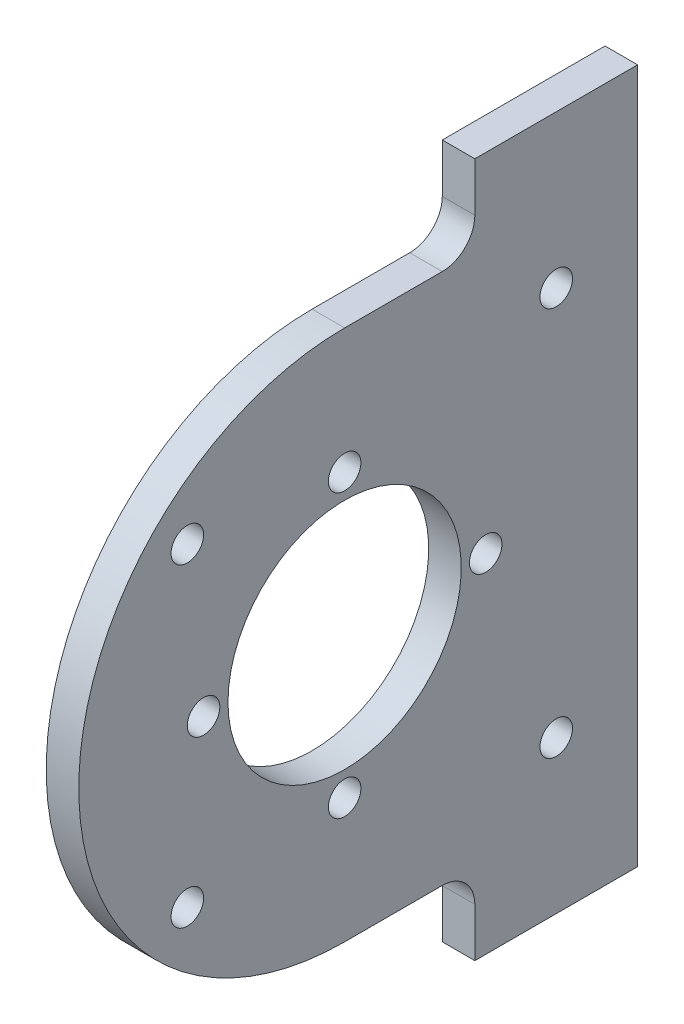
ISO-10303-21;
HEADER;
FILE_DESCRIPTION(('STEP AP214'),'2;1');
FILE_NAME('part.step','',(''),(''),'','','');
FILE_SCHEMA(('AUTOMOTIVE_DESIGN { 1 0 10303 214 1 1 1 1 }'));
ENDSEC;
DATA;
#1=APPLICATION_CONTEXT('core data for automotive mechanical design processes');
#2=APPLICATION_PROTOCOL_DEFINITION('international standard','automotive_design',2000,#1);
#3=PRODUCT_CONTEXT('',#1,'mechanical');
#4=PRODUCT('Part','Part','',(#3));
#5=PRODUCT_RELATED_PRODUCT_CATEGORY('part','',(#4));
#6=PRODUCT_DEFINITION_FORMATION('','',#4);
#7=PRODUCT_DEFINITION_CONTEXT('part definition',#1,'design');
#8=PRODUCT_DEFINITION('design','',#6,#7);
#9=PRODUCT_DEFINITION_SHAPE('','',#8);
#10=(LENGTH_UNIT() NAMED_UNIT(*) SI_UNIT(.MILLI.,.METRE.));
#11=(NAMED_UNIT(*) PLANE_ANGLE_UNIT() SI_UNIT($,.RADIAN.));
#12=(NAMED_UNIT(*) SI_UNIT($,.STERADIAN.) SOLID_ANGLE_UNIT());
#13=UNCERTAINTY_MEASURE_WITH_UNIT(LENGTH_MEASURE(1.E-05),#10,'distance_accuracy_value','');
#14=(GEOMETRIC_REPRESENTATION_CONTEXT(3) GLOBAL_UNCERTAINTY_ASSIGNED_CONTEXT((#13)) GLOBAL_UNIT_ASSIGNED_CONTEXT((#10,
#11,#12)) REPRESENTATION_CONTEXT('',''));
#15=CARTESIAN_POINT('',(0.,0.,0.));
#16=DIRECTION('',(0.,0.,1.));
#17=DIRECTION('',(1.,0.,0.));
#18=AXIS2_PLACEMENT_3D('',#15,#16,#17);
#19=CARTESIAN_POINT('',(-109.5,-24.5,0.));
#20=DIRECTION('',(0.,-1.,0.));
#21=DIRECTION('',(0.,0.,-1.));
#22=AXIS2_PLACEMENT_3D('',#19,#20,#21);
#23=PLANE('',#22);
#24=DIRECTION('',(0.,0.,1.));
#25=VECTOR('',#24,1.);
#26=CARTESIAN_POINT('',(-112.5,-24.5,0.));
#27=LINE('',#26,#25);
#28=CARTESIAN_POINT('',(-112.5,-24.5,21.));
#29=VERTEX_POINT('',#28);
#30=CARTESIAN_POINT('',(-112.5,-24.5,30.));
#31=VERTEX_POINT('',#30);
#32=EDGE_CURVE('E185',#29,#31,#27,.T.);
#33=ORIENTED_EDGE('',*,*,#32,.F.);
#34=DIRECTION('',(-1.,0.,0.));
#35=VECTOR('',#34,1.);
#36=CARTESIAN_POINT('',(-109.5,-24.5,21.));
#37=LINE('',#36,#35);
#38=CARTESIAN_POINT('',(-109.5,-24.5,21.));
#39=VERTEX_POINT('',#38);
#40=EDGE_CURVE('E13',#39,#29,#37,.T.);
#41=ORIENTED_EDGE('',*,*,#40,.F.);
#42=DIRECTION('',(0.,0.,1.));
#43=VECTOR('',#42,1.);
#44=CARTESIAN_POINT('',(-109.5,-24.5,0.));
#45=LINE('',#44,#43);
#46=CARTESIAN_POINT('',(-109.5,-24.5,30.));
#47=VERTEX_POINT('',#46);
#48=EDGE_CURVE('E228',#39,#47,#45,.T.);
#49=ORIENTED_EDGE('',*,*,#48,.T.);
#50=DIRECTION('',(-1.,0.,0.));
#51=VECTOR('',#50,1.);
#52=CARTESIAN_POINT('',(-109.5,-24.5,30.));
#53=LINE('',#52,#51);
#54=EDGE_CURVE('E52',#47,#31,#53,.T.);
#55=ORIENTED_EDGE('',*,*,#54,.T.);
#56=EDGE_LOOP('',(#33,#41,#49,#55));
#57=FACE_BOUND('',#56,.T.);
#58=ADVANCED_FACE('F48',(#57),#23,.T.);
#59=CARTESIAN_POINT('',(-109.5,-27.5,21.));
#60=DIRECTION('',(-1.,0.,0.));
#61=DIRECTION('',(0.,0.,1.));
#62=AXIS2_PLACEMENT_3D('',#59,#60,#61);
#63=CYLINDRICAL_SURFACE('',#62,3.);
#64=CARTESIAN_POINT('',(-112.5,-27.5,21.));
#65=DIRECTION('',(-1.,0.,0.));
#66=DIRECTION('',(0.,0.,1.));
#67=AXIS2_PLACEMENT_3D('',#64,#65,#66);
#68=CIRCLE('',#67,3.);
#69=CARTESIAN_POINT('',(-112.5,-27.5,18.));
#70=VERTEX_POINT('',#69);
#71=EDGE_CURVE('E209',#70,#29,#68,.F.);
#72=ORIENTED_EDGE('',*,*,#71,.F.);
#73=DIRECTION('',(-1.,0.,0.));
#74=VECTOR('',#73,1.);
#75=CARTESIAN_POINT('',(-109.5,-27.5,18.));
#76=LINE('',#75,#74);
#77=CARTESIAN_POINT('',(-109.5,-27.5,18.));
#78=VERTEX_POINT('',#77);
#79=EDGE_CURVE('E58',#78,#70,#76,.T.);
#80=ORIENTED_EDGE('',*,*,#79,.F.);
#81=CARTESIAN_POINT('',(-109.5,-27.5,21.));
#82=DIRECTION('',(-1.,0.,0.));
#83=DIRECTION('',(0.,0.,1.));
#84=AXIS2_PLACEMENT_3D('',#81,#82,#83);
#85=CIRCLE('',#84,3.);
#86=EDGE_CURVE('E147',#78,#39,#85,.F.);
#87=ORIENTED_EDGE('',*,*,#86,.T.);
#88=ORIENTED_EDGE('',*,*,#40,.T.);
#89=EDGE_LOOP('',(#72,#80,#87,#88));
#90=FACE_BOUND('',#89,.T.);
#91=ADVANCED_FACE('F232',(#90),#63,.F.);
#92=CARTESIAN_POINT('',(-109.5,0.,18.));
#93=DIRECTION('',(0.,0.,1.));
#94=DIRECTION('',(1.,0.,0.));
#95=AXIS2_PLACEMENT_3D('',#92,#93,#94);
#96=PLANE('',#95);
#97=DIRECTION('',(0.,1.,0.));
#98=VECTOR('',#97,1.);
#99=CARTESIAN_POINT('',(-112.5,0.,18.));
#100=LINE('',#99,#98);
#101=CARTESIAN_POINT('',(-112.5,-32.,18.));
#102=VERTEX_POINT('',#101);
#103=EDGE_CURVE('E135',#102,#70,#100,.T.);
#104=ORIENTED_EDGE('',*,*,#103,.F.);
#105=DIRECTION('',(-1.,0.,0.));
#106=VECTOR('',#105,1.);
#107=CARTESIAN_POINT('',(-109.5,-32.,18.));
#108=LINE('',#107,#106);
#109=CARTESIAN_POINT('',(-109.5,-32.,18.));
#110=VERTEX_POINT('',#109);
#111=EDGE_CURVE('E130',#110,#102,#108,.T.);
#112=ORIENTED_EDGE('',*,*,#111,.F.);
#113=DIRECTION('',(0.,1.,0.));
#114=VECTOR('',#113,1.);
#115=CARTESIAN_POINT('',(-109.5,0.,18.));
#116=LINE('',#115,#114);
#117=EDGE_CURVE('E133',#110,#78,#116,.T.);
#118=ORIENTED_EDGE('',*,*,#117,.T.);
#119=ORIENTED_EDGE('',*,*,#79,.T.);
#120=EDGE_LOOP('',(#104,#112,#118,#119));
#121=FACE_BOUND('',#120,.T.);
#122=ADVANCED_FACE('F132',(#121),#96,.T.);
#123=CARTESIAN_POINT('',(-109.5,-32.,0.));
#124=DIRECTION('',(0.,-1.,0.));
#125=DIRECTION('',(0.,0.,-1.));
#126=AXIS2_PLACEMENT_3D('',#123,#124,#125);
#127=PLANE('',#126);
#128=DIRECTION('',(0.,0.,1.));
#129=VECTOR('',#128,1.);
#130=CARTESIAN_POINT('',(-112.5,-32.,0.));
#131=LINE('',#130,#129);
#132=CARTESIAN_POINT('',(-112.5,-32.,3.));
#133=VERTEX_POINT('',#132);
#134=EDGE_CURVE('E206',#133,#102,#131,.T.);
#135=ORIENTED_EDGE('',*,*,#134,.F.);
#136=DIRECTION('',(-1.,0.,0.));
#137=VECTOR('',#136,1.);
#138=CARTESIAN_POINT('',(-109.5,-32.,3.));
#139=LINE('',#138,#137);
#140=CARTESIAN_POINT('',(-109.5,-32.,3.));
#141=VERTEX_POINT('',#140);
#142=EDGE_CURVE('E140',#141,#133,#139,.T.);
#143=ORIENTED_EDGE('',*,*,#142,.F.);
#144=DIRECTION('',(0.,0.,1.));
#145=VECTOR('',#144,1.);
#146=CARTESIAN_POINT('',(-109.5,-32.,0.));
#147=LINE('',#146,#145);
#148=EDGE_CURVE('E146',#141,#110,#147,.T.);
#149=ORIENTED_EDGE('',*,*,#148,.T.);
#150=ORIENTED_EDGE('',*,*,#111,.T.);
#151=EDGE_LOOP('',(#135,#143,#149,#150));
#152=FACE_BOUND('',#151,.T.);
#153=ADVANCED_FACE('F149',(#152),#127,.T.);
#154=CARTESIAN_POINT('',(-109.5,0.,3.));
#155=DIRECTION('',(0.,0.,1.));
#156=DIRECTION('',(1.,0.,0.));
#157=AXIS2_PLACEMENT_3D('',#154,#155,#156);
#158=PLANE('',#157);
#159=DIRECTION('',(0.,1.,0.));
#160=VECTOR('',#159,1.);
#161=CARTESIAN_POINT('',(-112.5,0.,3.));
#162=LINE('',#161,#160);
#163=CARTESIAN_POINT('',(-112.5,32.,3.));
#164=VERTEX_POINT('',#163);
#165=EDGE_CURVE('E203',#133,#164,#162,.T.);
#166=ORIENTED_EDGE('',*,*,#165,.T.);
#167=DIRECTION('',(-1.,0.,0.));
#168=VECTOR('',#167,1.);
#169=CARTESIAN_POINT('',(-109.5,32.,3.));
#170=LINE('',#169,#168);
#171=CARTESIAN_POINT('',(-109.5,32.,3.));
#172=VERTEX_POINT('',#171);
#173=EDGE_CURVE('E215',#172,#164,#170,.T.);
#174=ORIENTED_EDGE('',*,*,#173,.F.);
#175=DIRECTION('',(0.,1.,0.));
#176=VECTOR('',#175,1.);
#177=CARTESIAN_POINT('',(-109.5,0.,3.));
#178=LINE('',#177,#176);
#179=EDGE_CURVE('E151',#141,#172,#178,.T.);
#180=ORIENTED_EDGE('',*,*,#179,.F.);
#181=ORIENTED_EDGE('',*,*,#142,.T.);
#182=EDGE_LOOP('',(#166,#174,#180,#181));
#183=FACE_BOUND('',#182,.T.);
#184=ADVANCED_FACE('F246',(#183),#158,.F.);
#185=CARTESIAN_POINT('',(-109.5,32.,0.));
#186=DIRECTION('',(0.,-1.,0.));
#187=DIRECTION('',(0.,0.,-1.));
#188=AXIS2_PLACEMENT_3D('',#185,#186,#187);
#189=PLANE('',#188);
#190=DIRECTION('',(0.,0.,1.));
#191=VECTOR('',#190,1.);
#192=CARTESIAN_POINT('',(-112.5,32.,0.));
#193=LINE('',#192,#191);
#194=CARTESIAN_POINT('',(-112.5,32.,18.));
#195=VERTEX_POINT('',#194);
#196=EDGE_CURVE('E200',#164,#195,#193,.T.);
#197=ORIENTED_EDGE('',*,*,#196,.T.);
#198=DIRECTION('',(-1.,0.,0.));
#199=VECTOR('',#198,1.);
#200=CARTESIAN_POINT('',(-109.5,32.,18.));
#201=LINE('',#200,#199);
#202=CARTESIAN_POINT('',(-109.5,32.,18.));
#203=VERTEX_POINT('',#202);
#204=EDGE_CURVE('E218',#203,#195,#201,.T.);
#205=ORIENTED_EDGE('',*,*,#204,.F.);
#206=DIRECTION('',(0.,0.,1.));
#207=VECTOR('',#206,1.);
#208=CARTESIAN_POINT('',(-109.5,32.,0.));
#209=LINE('',#208,#207);
#210=EDGE_CURVE('E153',#172,#203,#209,.T.);
#211=ORIENTED_EDGE('',*,*,#210,.F.);
#212=ORIENTED_EDGE('',*,*,#173,.T.);
#213=EDGE_LOOP('',(#197,#205,#211,#212));
#214=FACE_BOUND('',#213,.T.);
#215=ADVANCED_FACE('F249',(#214),#189,.F.);
#216=CARTESIAN_POINT('',(-109.5,0.,18.));
#217=DIRECTION('',(0.,0.,-1.));
#218=DIRECTION('',(-1.,0.,0.));
#219=AXIS2_PLACEMENT_3D('',#216,#217,#218);
#220=PLANE('',#219);
#221=DIRECTION('',(0.,-1.,0.));
#222=VECTOR('',#221,1.);
#223=CARTESIAN_POINT('',(-112.5,0.,18.));
#224=LINE('',#223,#222);
#225=CARTESIAN_POINT('',(-112.5,27.5,18.));
#226=VERTEX_POINT('',#225);
#227=EDGE_CURVE('E197',#195,#226,#224,.T.);
#228=ORIENTED_EDGE('',*,*,#227,.T.);
#229=DIRECTION('',(-1.,0.,0.));
#230=VECTOR('',#229,1.);
#231=CARTESIAN_POINT('',(-109.5,27.5,18.));
#232=LINE('',#231,#230);
#233=CARTESIAN_POINT('',(-109.5,27.5,18.));
#234=VERTEX_POINT('',#233);
#235=EDGE_CURVE('E221',#234,#226,#232,.T.);
#236=ORIENTED_EDGE('',*,*,#235,.F.);
#237=DIRECTION('',(0.,-1.,0.));
#238=VECTOR('',#237,1.);
#239=CARTESIAN_POINT('',(-109.5,0.,18.));
#240=LINE('',#239,#238);
#241=EDGE_CURVE('E382',#203,#234,#240,.T.);
#242=ORIENTED_EDGE('',*,*,#241,.F.);
#243=ORIENTED_EDGE('',*,*,#204,.T.);
#244=EDGE_LOOP('',(#228,#236,#242,#243));
#245=FACE_BOUND('',#244,.T.);
#246=ADVANCED_FACE('F253',(#245),#220,.F.);
#247=CARTESIAN_POINT('',(-109.5,27.5,21.));
#248=DIRECTION('',(-1.,0.,0.));
#249=DIRECTION('',(0.,0.,1.));
#250=AXIS2_PLACEMENT_3D('',#247,#248,#249);
#251=CYLINDRICAL_SURFACE('',#250,3.);
#252=CARTESIAN_POINT('',(-112.5,27.5,21.));
#253=DIRECTION('',(-1.,0.,0.));
#254=DIRECTION('',(0.,0.,1.));
#255=AXIS2_PLACEMENT_3D('',#252,#253,#254);
#256=CIRCLE('',#255,3.);
#257=CARTESIAN_POINT('',(-112.5,24.5,21.));
#258=VERTEX_POINT('',#257);
#259=EDGE_CURVE('E194',#226,#258,#256,.T.);
#260=ORIENTED_EDGE('',*,*,#259,.T.);
#261=DIRECTION('',(-1.,0.,0.));
#262=VECTOR('',#261,1.);
#263=CARTESIAN_POINT('',(-109.5,24.5,21.));
#264=LINE('',#263,#262);
#265=CARTESIAN_POINT('',(-109.5,24.5,21.));
#266=VERTEX_POINT('',#265);
#267=EDGE_CURVE('E224',#266,#258,#264,.T.);
#268=ORIENTED_EDGE('',*,*,#267,.F.);
#269=CARTESIAN_POINT('',(-109.5,27.5,21.));
#270=DIRECTION('',(-1.,0.,0.));
#271=DIRECTION('',(0.,0.,1.));
#272=AXIS2_PLACEMENT_3D('',#269,#270,#271);
#273=CIRCLE('',#272,3.);
#274=EDGE_CURVE('E379',#234,#266,#273,.T.);
#275=ORIENTED_EDGE('',*,*,#274,.F.);
#276=ORIENTED_EDGE('',*,*,#235,.T.);
#277=EDGE_LOOP('',(#260,#268,#275,#276));
#278=FACE_BOUND('',#277,.T.);
#279=ADVANCED_FACE('F257',(#278),#251,.F.);
#280=CARTESIAN_POINT('',(-109.5,24.5,0.));
#281=DIRECTION('',(0.,-1.,0.));
#282=DIRECTION('',(0.,0.,-1.));
#283=AXIS2_PLACEMENT_3D('',#280,#281,#282);
#284=PLANE('',#283);
#285=DIRECTION('',(0.,0.,1.));
#286=VECTOR('',#285,1.);
#287=CARTESIAN_POINT('',(-112.5,24.5,0.));
#288=LINE('',#287,#286);
#289=CARTESIAN_POINT('',(-112.5,24.5,30.));
#290=VERTEX_POINT('',#289);
#291=EDGE_CURVE('E191',#258,#290,#288,.T.);
#292=ORIENTED_EDGE('',*,*,#291,.T.);
#293=DIRECTION('',(-1.,0.,0.));
#294=VECTOR('',#293,1.);
#295=CARTESIAN_POINT('',(-109.5,24.5,30.));
#296=LINE('',#295,#294);
#297=CARTESIAN_POINT('',(-109.5,24.5,30.));
#298=VERTEX_POINT('',#297);
#299=EDGE_CURVE('E226',#298,#290,#296,.T.);
#300=ORIENTED_EDGE('',*,*,#299,.F.);
#301=DIRECTION('',(0.,0.,1.));
#302=VECTOR('',#301,1.);
#303=CARTESIAN_POINT('',(-109.5,24.5,0.));
#304=LINE('',#303,#302);
#305=EDGE_CURVE('E377',#266,#298,#304,.T.);
#306=ORIENTED_EDGE('',*,*,#305,.F.);
#307=ORIENTED_EDGE('',*,*,#267,.T.);
#308=EDGE_LOOP('',(#292,#300,#306,#307));
#309=FACE_BOUND('',#308,.T.);
#310=ADVANCED_FACE('F261',(#309),#284,.F.);
#311=CARTESIAN_POINT('',(-109.5,-17.9443584449264,10.5));
#312=DIRECTION('',(-1.,0.,0.));
#313=DIRECTION('',(0.,0.,1.));
#314=AXIS2_PLACEMENT_3D('',#311,#312,#313);
#315=CYLINDRICAL_SURFACE('',#314,1.5);
#316=CARTESIAN_POINT('',(-109.5,-17.9443584449264,10.5));
#317=DIRECTION('',(-1.,0.,0.));
#318=DIRECTION('',(0.,0.,1.));
#319=AXIS2_PLACEMENT_3D('',#316,#317,#318);
#320=CIRCLE('',#319,1.5);
#321=CARTESIAN_POINT('',(-109.5,-17.9443584449264,12.));
#322=VERTEX_POINT('',#321);
#323=EDGE_CURVE('E369',#322,#322,#320,.T.);
#324=ORIENTED_EDGE('',*,*,#323,.F.);
#325=EDGE_LOOP('',(#324));
#326=FACE_BOUND('',#325,.T.);
#327=CARTESIAN_POINT('',(-112.5,-17.9443584449264,10.5));
#328=DIRECTION('',(-1.,0.,0.));
#329=DIRECTION('',(0.,0.,1.));
#330=AXIS2_PLACEMENT_3D('',#327,#328,#329);
#331=CIRCLE('',#330,1.5);
#332=CARTESIAN_POINT('',(-112.5,-17.9443584449264,12.));
#333=VERTEX_POINT('',#332);
#334=EDGE_CURVE('E182',#333,#333,#331,.T.);
#335=ORIENTED_EDGE('',*,*,#334,.T.);
#336=EDGE_LOOP('',(#335));
#337=FACE_BOUND('',#336,.T.);
#338=ADVANCED_FACE('F265',(#326,#337),#315,.F.);
#339=CARTESIAN_POINT('',(-109.5,13.,30.));
#340=DIRECTION('',(-1.,0.,0.));
#341=DIRECTION('',(0.,0.,1.));
#342=AXIS2_PLACEMENT_3D('',#339,#340,#341);
#343=CYLINDRICAL_SURFACE('',#342,1.5);
#344=CARTESIAN_POINT('',(-109.5,13.,30.));
#345=DIRECTION('',(-1.,0.,0.));
#346=DIRECTION('',(0.,0.,1.));
#347=AXIS2_PLACEMENT_3D('',#344,#345,#346);
#348=CIRCLE('',#347,1.5);
#349=CARTESIAN_POINT('',(-109.5,13.,31.5));
#350=VERTEX_POINT('',#349);
#351=EDGE_CURVE('E366',#350,#350,#348,.T.);
#352=ORIENTED_EDGE('',*,*,#351,.F.);
#353=EDGE_LOOP('',(#352));
#354=FACE_BOUND('',#353,.T.);
#355=CARTESIAN_POINT('',(-112.5,13.,30.));
#356=DIRECTION('',(-1.,0.,0.));
#357=DIRECTION('',(0.,0.,1.));
#358=AXIS2_PLACEMENT_3D('',#355,#356,#357);
#359=CIRCLE('',#358,1.5);
#360=CARTESIAN_POINT('',(-112.5,13.,31.5));
#361=VERTEX_POINT('',#360);
#362=EDGE_CURVE('E179',#361,#361,#359,.T.);
#363=ORIENTED_EDGE('',*,*,#362,.T.);
#364=EDGE_LOOP('',(#363));
#365=FACE_BOUND('',#364,.T.);
#366=ADVANCED_FACE('F271',(#354,#365),#343,.F.);
#367=CARTESIAN_POINT('',(-109.5,0.,43.));
#368=DIRECTION('',(-1.,0.,0.));
#369=DIRECTION('',(0.,0.,1.));
#370=AXIS2_PLACEMENT_3D('',#367,#368,#369);
#371=CYLINDRICAL_SURFACE('',#370,1.5);
#372=CARTESIAN_POINT('',(-109.5,0.,43.));
#373=DIRECTION('',(-1.,0.,0.));
#374=DIRECTION('',(0.,0.,1.));
#375=AXIS2_PLACEMENT_3D('',#372,#373,#374);
#376=CIRCLE('',#375,1.5);
#377=CARTESIAN_POINT('',(-109.5,0.,44.5));
#378=VERTEX_POINT('',#377);
#379=EDGE_CURVE('E362',#378,#378,#376,.T.);
#380=ORIENTED_EDGE('',*,*,#379,.F.);
#381=EDGE_LOOP('',(#380));
#382=FACE_BOUND('',#381,.T.);
#383=CARTESIAN_POINT('',(-112.5,0.,43.));
#384=DIRECTION('',(-1.,0.,0.));
#385=DIRECTION('',(0.,0.,1.));
#386=AXIS2_PLACEMENT_3D('',#383,#384,#385);
#387=CIRCLE('',#386,1.5);
#388=CARTESIAN_POINT('',(-112.5,0.,44.5));
#389=VERTEX_POINT('',#388);
#390=EDGE_CURVE('E176',#389,#389,#387,.T.);
#391=ORIENTED_EDGE('',*,*,#390,.T.);
#392=EDGE_LOOP('',(#391));
#393=FACE_BOUND('',#392,.T.);
#394=ADVANCED_FACE('F275',(#382,#393),#371,.F.);
#395=CARTESIAN_POINT('',(-109.5,-13.,30.));
#396=DIRECTION('',(-1.,0.,0.));
#397=DIRECTION('',(0.,0.,1.));
#398=AXIS2_PLACEMENT_3D('',#395,#396,#397);
#399=CYLINDRICAL_SURFACE('',#398,1.5);
#400=CARTESIAN_POINT('',(-109.5,-13.,30.));
#401=DIRECTION('',(-1.,0.,0.));
#402=DIRECTION('',(0.,0.,1.));
#403=AXIS2_PLACEMENT_3D('',#400,#401,#402);
#404=CIRCLE('',#403,1.5);
#405=CARTESIAN_POINT('',(-109.5,-13.,31.5));
#406=VERTEX_POINT('',#405);
#407=EDGE_CURVE('E358',#406,#406,#404,.T.);
#408=ORIENTED_EDGE('',*,*,#407,.F.);
#409=EDGE_LOOP('',(#408));
#410=FACE_BOUND('',#409,.T.);
#411=CARTESIAN_POINT('',(-112.5,-13.,30.));
#412=DIRECTION('',(-1.,0.,0.));
#413=DIRECTION('',(0.,0.,1.));
#414=AXIS2_PLACEMENT_3D('',#411,#412,#413);
#415=CIRCLE('',#414,1.5);
#416=CARTESIAN_POINT('',(-112.5,-13.,31.5));
#417=VERTEX_POINT('',#416);
#418=EDGE_CURVE('E173',#417,#417,#415,.T.);
#419=ORIENTED_EDGE('',*,*,#418,.T.);
#420=EDGE_LOOP('',(#419));
#421=FACE_BOUND('',#420,.T.);
#422=ADVANCED_FACE('F279',(#410,#421),#399,.F.);
#423=CARTESIAN_POINT('',(-109.5,0.,17.));
#424=DIRECTION('',(-1.,0.,0.));
#425=DIRECTION('',(0.,0.,1.));
#426=AXIS2_PLACEMENT_3D('',#423,#424,#425);
#427=CYLINDRICAL_SURFACE('',#426,1.5);
#428=CARTESIAN_POINT('',(-109.5,0.,17.));
#429=DIRECTION('',(-1.,0.,0.));
#430=DIRECTION('',(0.,0.,1.));
#431=AXIS2_PLACEMENT_3D('',#428,#429,#430);
#432=CIRCLE('',#431,1.5);
#433=CARTESIAN_POINT('',(-109.5,0.,18.5));
#434=VERTEX_POINT('',#433);
#435=EDGE_CURVE('E354',#434,#434,#432,.T.);
#436=ORIENTED_EDGE('',*,*,#435,.F.);
#437=EDGE_LOOP('',(#436));
#438=FACE_BOUND('',#437,.T.);
#439=CARTESIAN_POINT('',(-112.5,0.,17.));
#440=DIRECTION('',(-1.,0.,0.));
#441=DIRECTION('',(0.,0.,1.));
#442=AXIS2_PLACEMENT_3D('',#439,#440,#441);
#443=CIRCLE('',#442,1.5);
#444=CARTESIAN_POINT('',(-112.5,0.,18.5));
#445=VERTEX_POINT('',#444);
#446=EDGE_CURVE('E170',#445,#445,#443,.T.);
#447=ORIENTED_EDGE('',*,*,#446,.T.);
#448=EDGE_LOOP('',(#447));
#449=FACE_BOUND('',#448,.T.);
#450=ADVANCED_FACE('F283',(#438,#449),#427,.F.);
#451=CARTESIAN_POINT('',(-109.5,0.,30.));
#452=DIRECTION('',(-1.,0.,0.));
#453=DIRECTION('',(0.,0.,1.));
#454=AXIS2_PLACEMENT_3D('',#451,#452,#453);
#455=CYLINDRICAL_SURFACE('',#454,10.75);
#456=CARTESIAN_POINT('',(-109.5,0.,30.));
#457=DIRECTION('',(-1.,0.,0.));
#458=DIRECTION('',(0.,0.,1.));
#459=AXIS2_PLACEMENT_3D('',#456,#457,#458);
#460=CIRCLE('',#459,10.75);
#461=CARTESIAN_POINT('',(-109.5,0.,40.75));
#462=VERTEX_POINT('',#461);
#463=EDGE_CURVE('E350',#462,#462,#460,.T.);
#464=ORIENTED_EDGE('',*,*,#463,.F.);
#465=EDGE_LOOP('',(#464));
#466=FACE_BOUND('',#465,.T.);
#467=CARTESIAN_POINT('',(-112.5,0.,30.));
#468=DIRECTION('',(-1.,0.,0.));
#469=DIRECTION('',(0.,0.,1.));
#470=AXIS2_PLACEMENT_3D('',#467,#468,#469);
#471=CIRCLE('',#470,10.75);
#472=CARTESIAN_POINT('',(-112.5,0.,40.75));
#473=VERTEX_POINT('',#472);
#474=EDGE_CURVE('E167',#473,#473,#471,.T.);
#475=ORIENTED_EDGE('',*,*,#474,.T.);
#476=EDGE_LOOP('',(#475));
#477=FACE_BOUND('',#476,.T.);
#478=ADVANCED_FACE('F287',(#466,#477),#455,.F.);
#479=CARTESIAN_POINT('',(-109.5,17.9443584449264,10.5));
#480=DIRECTION('',(-1.,0.,0.));
#481=DIRECTION('',(0.,0.,1.));
#482=AXIS2_PLACEMENT_3D('',#479,#480,#481);
#483=CYLINDRICAL_SURFACE('',#482,1.5);
#484=CARTESIAN_POINT('',(-109.5,17.9443584449264,10.5));
#485=DIRECTION('',(-1.,0.,0.));
#486=DIRECTION('',(0.,0.,1.));
#487=AXIS2_PLACEMENT_3D('',#484,#485,#486);
#488=CIRCLE('',#487,1.5);
#489=CARTESIAN_POINT('',(-109.5,17.9443584449264,12.));
#490=VERTEX_POINT('',#489);
#491=EDGE_CURVE('E346',#490,#490,#488,.F.);
#492=ORIENTED_EDGE('',*,*,#491,.T.);
#493=EDGE_LOOP('',(#492));
#494=FACE_BOUND('',#493,.T.);
#495=CARTESIAN_POINT('',(-112.5,17.9443584449264,10.5));
#496=DIRECTION('',(-1.,0.,0.));
#497=DIRECTION('',(0.,0.,1.));
#498=AXIS2_PLACEMENT_3D('',#495,#496,#497);
#499=CIRCLE('',#498,1.5);
#500=CARTESIAN_POINT('',(-112.5,17.9443584449264,12.));
#501=VERTEX_POINT('',#500);
#502=EDGE_CURVE('E164',#501,#501,#499,.F.);
#503=ORIENTED_EDGE('',*,*,#502,.F.);
#504=EDGE_LOOP('',(#503));
#505=FACE_BOUND('',#504,.T.);
#506=ADVANCED_FACE('F291',(#494,#505),#483,.F.);
#507=CARTESIAN_POINT('',(-109.5,14.4956890143242,44.4956890143243));
#508=DIRECTION('',(-1.,0.,0.));
#509=DIRECTION('',(0.,0.,1.));
#510=AXIS2_PLACEMENT_3D('',#507,#508,#509);
#511=CYLINDRICAL_SURFACE('',#510,1.5);
#512=CARTESIAN_POINT('',(-109.5,14.4956890143242,44.4956890143243));
#513=DIRECTION('',(-1.,0.,0.));
#514=DIRECTION('',(0.,0.,1.));
#515=AXIS2_PLACEMENT_3D('',#512,#513,#514);
#516=CIRCLE('',#515,1.5);
#517=CARTESIAN_POINT('',(-109.5,14.4956890143242,45.9956890143243));
#518=VERTEX_POINT('',#517);
#519=EDGE_CURVE('E305',#518,#518,#516,.T.);
#520=ORIENTED_EDGE('',*,*,#519,.F.);
#521=EDGE_LOOP('',(#520));
#522=FACE_BOUND('',#521,.T.);
#523=CARTESIAN_POINT('',(-112.5,14.4956890143242,44.4956890143243));
#524=DIRECTION('',(-1.,0.,0.));
#525=DIRECTION('',(0.,0.,1.));
#526=AXIS2_PLACEMENT_3D('',#523,#524,#525);
#527=CIRCLE('',#526,1.5);
#528=CARTESIAN_POINT('',(-112.5,14.4956890143242,45.9956890143243));
#529=VERTEX_POINT('',#528);
#530=EDGE_CURVE('E161',#529,#529,#527,.T.);
#531=ORIENTED_EDGE('',*,*,#530,.T.);
#532=EDGE_LOOP('',(#531));
#533=FACE_BOUND('',#532,.T.);
#534=ADVANCED_FACE('F294',(#522,#533),#511,.F.);
#535=CARTESIAN_POINT('',(-109.5,-14.4956890143242,44.4956890143243));
#536=DIRECTION('',(-1.,0.,0.));
#537=DIRECTION('',(0.,0.,1.));
#538=AXIS2_PLACEMENT_3D('',#535,#536,#537);
#539=CYLINDRICAL_SURFACE('',#538,1.5);
#540=CARTESIAN_POINT('',(-109.5,-14.4956890143242,44.4956890143243));
#541=DIRECTION('',(-1.,0.,0.));
#542=DIRECTION('',(0.,0.,1.));
#543=AXIS2_PLACEMENT_3D('',#540,#541,#542);
#544=CIRCLE('',#543,1.5);
#545=CARTESIAN_POINT('',(-109.5,-14.4956890143242,45.9956890143243));
#546=VERTEX_POINT('',#545);
#547=EDGE_CURVE('E211',#546,#546,#544,.T.);
#548=ORIENTED_EDGE('',*,*,#547,.F.);
#549=EDGE_LOOP('',(#548));
#550=FACE_BOUND('',#549,.T.);
#551=CARTESIAN_POINT('',(-112.5,-14.4956890143242,44.4956890143243));
#552=DIRECTION('',(-1.,0.,0.));
#553=DIRECTION('',(0.,0.,1.));
#554=AXIS2_PLACEMENT_3D('',#551,#552,#553);
#555=CIRCLE('',#554,1.5);
#556=CARTESIAN_POINT('',(-112.5,-14.4956890143242,45.9956890143243));
#557=VERTEX_POINT('',#556);
#558=EDGE_CURVE('E158',#557,#557,#555,.T.);
#559=ORIENTED_EDGE('',*,*,#558,.T.);
#560=EDGE_LOOP('',(#559));
#561=FACE_BOUND('',#560,.T.);
#562=ADVANCED_FACE('F50',(#550,#561),#539,.F.);
#563=CARTESIAN_POINT('',(-109.5,0.,30.));
#564=DIRECTION('',(-1.,0.,0.));
#565=DIRECTION('',(0.,0.,1.));
#566=AXIS2_PLACEMENT_3D('',#563,#564,#565);
#567=CYLINDRICAL_SURFACE('',#566,24.5);
#568=CARTESIAN_POINT('',(-112.5,0.,30.));
#569=DIRECTION('',(-1.,0.,0.));
#570=DIRECTION('',(0.,0.,1.));
#571=AXIS2_PLACEMENT_3D('',#568,#569,#570);
#572=CIRCLE('',#571,24.5);
#573=EDGE_CURVE('E188',#31,#290,#572,.T.);
#574=ORIENTED_EDGE('',*,*,#573,.F.);
#575=ORIENTED_EDGE('',*,*,#54,.F.);
#576=CARTESIAN_POINT('',(-109.5,0.,30.));
#577=DIRECTION('',(-1.,0.,0.));
#578=DIRECTION('',(0.,0.,1.));
#579=AXIS2_PLACEMENT_3D('',#576,#577,#578);
#580=CIRCLE('',#579,24.5);
#581=EDGE_CURVE('E371',#47,#298,#580,.T.);
#582=ORIENTED_EDGE('',*,*,#581,.T.);
#583=ORIENTED_EDGE('',*,*,#299,.T.);
#584=EDGE_LOOP('',(#574,#575,#582,#583));
#585=FACE_BOUND('',#584,.T.);
#586=ADVANCED_FACE('F229',(#585),#567,.T.);
#587=CARTESIAN_POINT('',(-109.5,0.,0.));
#588=DIRECTION('',(-1.,0.,0.));
#589=DIRECTION('',(0.,0.,1.));
#590=AXIS2_PLACEMENT_3D('',#587,#588,#589);
#591=PLANE('',#590);
#592=ORIENTED_EDGE('',*,*,#547,.T.);
#593=EDGE_LOOP('',(#592));
#594=FACE_BOUND('',#593,.T.);
#595=ORIENTED_EDGE('',*,*,#519,.T.);
#596=EDGE_LOOP('',(#595));
#597=FACE_BOUND('',#596,.T.);
#598=ORIENTED_EDGE('',*,*,#491,.F.);
#599=EDGE_LOOP('',(#598));
#600=FACE_BOUND('',#599,.T.);
#601=ORIENTED_EDGE('',*,*,#463,.T.);
#602=EDGE_LOOP('',(#601));
#603=FACE_BOUND('',#602,.T.);
#604=ORIENTED_EDGE('',*,*,#435,.T.);
#605=EDGE_LOOP('',(#604));
#606=FACE_BOUND('',#605,.T.);
#607=ORIENTED_EDGE('',*,*,#407,.T.);
#608=EDGE_LOOP('',(#607));
#609=FACE_BOUND('',#608,.T.);
#610=ORIENTED_EDGE('',*,*,#379,.T.);
#611=EDGE_LOOP('',(#610));
#612=FACE_BOUND('',#611,.T.);
#613=ORIENTED_EDGE('',*,*,#351,.T.);
#614=EDGE_LOOP('',(#613));
#615=FACE_BOUND('',#614,.T.);
#616=ORIENTED_EDGE('',*,*,#323,.T.);
#617=EDGE_LOOP('',(#616));
#618=FACE_BOUND('',#617,.T.);
#619=ORIENTED_EDGE('',*,*,#48,.F.);
#620=ORIENTED_EDGE('',*,*,#86,.F.);
#621=ORIENTED_EDGE('',*,*,#117,.F.);
#622=ORIENTED_EDGE('',*,*,#148,.F.);
#623=ORIENTED_EDGE('',*,*,#179,.T.);
#624=ORIENTED_EDGE('',*,*,#210,.T.);
#625=ORIENTED_EDGE('',*,*,#241,.T.);
#626=ORIENTED_EDGE('',*,*,#274,.T.);
#627=ORIENTED_EDGE('',*,*,#305,.T.);
#628=ORIENTED_EDGE('',*,*,#581,.F.);
#629=EDGE_LOOP('',(#619,#620,#621,#622,#623,#624,#625,#626,#627,#628));
#630=FACE_BOUND('',#629,.T.);
#631=ADVANCED_FACE('F144',(#594,#597,#600,#603,#606,#609,#612,#615,#618,#630),#591,.F.);
#632=CARTESIAN_POINT('',(-112.5,0.,0.));
#633=DIRECTION('',(-1.,0.,0.));
#634=DIRECTION('',(0.,0.,1.));
#635=AXIS2_PLACEMENT_3D('',#632,#633,#634);
#636=PLANE('',#635);
#637=ORIENTED_EDGE('',*,*,#558,.F.);
#638=EDGE_LOOP('',(#637));
#639=FACE_BOUND('',#638,.T.);
#640=ORIENTED_EDGE('',*,*,#530,.F.);
#641=EDGE_LOOP('',(#640));
#642=FACE_BOUND('',#641,.T.);
#643=ORIENTED_EDGE('',*,*,#502,.T.);
#644=EDGE_LOOP('',(#643));
#645=FACE_BOUND('',#644,.T.);
#646=ORIENTED_EDGE('',*,*,#474,.F.);
#647=EDGE_LOOP('',(#646));
#648=FACE_BOUND('',#647,.T.);
#649=ORIENTED_EDGE('',*,*,#446,.F.);
#650=EDGE_LOOP('',(#649));
#651=FACE_BOUND('',#650,.T.);
#652=ORIENTED_EDGE('',*,*,#418,.F.);
#653=EDGE_LOOP('',(#652));
#654=FACE_BOUND('',#653,.T.);
#655=ORIENTED_EDGE('',*,*,#390,.F.);
#656=EDGE_LOOP('',(#655));
#657=FACE_BOUND('',#656,.T.);
#658=ORIENTED_EDGE('',*,*,#362,.F.);
#659=EDGE_LOOP('',(#658));
#660=FACE_BOUND('',#659,.T.);
#661=ORIENTED_EDGE('',*,*,#334,.F.);
#662=EDGE_LOOP('',(#661));
#663=FACE_BOUND('',#662,.T.);
#664=ORIENTED_EDGE('',*,*,#32,.T.);
#665=ORIENTED_EDGE('',*,*,#573,.T.);
#666=ORIENTED_EDGE('',*,*,#291,.F.);
#667=ORIENTED_EDGE('',*,*,#259,.F.);
#668=ORIENTED_EDGE('',*,*,#227,.F.);
#669=ORIENTED_EDGE('',*,*,#196,.F.);
#670=ORIENTED_EDGE('',*,*,#165,.F.);
#671=ORIENTED_EDGE('',*,*,#134,.T.);
#672=ORIENTED_EDGE('',*,*,#103,.T.);
#673=ORIENTED_EDGE('',*,*,#71,.T.);
#674=EDGE_LOOP('',(#664,#665,#666,#667,#668,#669,#670,#671,#672,#673));
#675=FACE_BOUND('',#674,.T.);
#676=ADVANCED_FACE('F231',(#639,#642,#645,#648,#651,#654,#657,#660,#663,#675),#636,.T.);
#677=CLOSED_SHELL('',(#58,#91,#122,#153,#184,#215,#246,#279,#310,#338,#366,#394,#422,#450,#478,
#506,#534,#562,#586,#631,#676));
#678=MANIFOLD_SOLID_BREP('B2',#677);
#679=ADVANCED_BREP_SHAPE_REPRESENTATION('',(#18,#678),#14);
#680=SHAPE_DEFINITION_REPRESENTATION(#9,#679);
ENDSEC;
END-ISO-10303-21;
